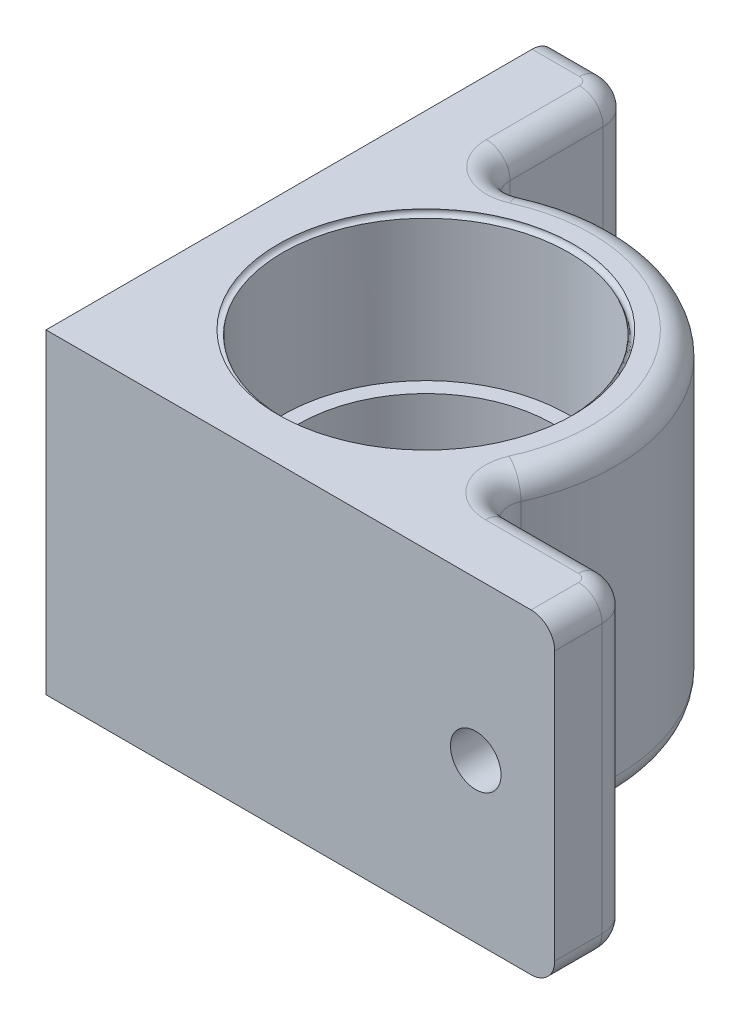
ISO-10303-21;
HEADER;
FILE_DESCRIPTION(('STEP AP214'),'2;1');
FILE_NAME('part.step','',(''),(''),'','','');
FILE_SCHEMA(('AUTOMOTIVE_DESIGN { 1 0 10303 214 1 1 1 1 }'));
ENDSEC;
DATA;
#1=APPLICATION_CONTEXT('core data for automotive mechanical design processes');
#2=APPLICATION_PROTOCOL_DEFINITION('international standard','automotive_design',2000,#1);
#3=PRODUCT_CONTEXT('',#1,'mechanical');
#4=PRODUCT('Part','Part','',(#3));
#5=PRODUCT_RELATED_PRODUCT_CATEGORY('part','',(#4));
#6=PRODUCT_DEFINITION_FORMATION('','',#4);
#7=PRODUCT_DEFINITION_CONTEXT('part definition',#1,'design');
#8=PRODUCT_DEFINITION('design','',#6,#7);
#9=PRODUCT_DEFINITION_SHAPE('','',#8);
#10=(LENGTH_UNIT() NAMED_UNIT(*) SI_UNIT(.MILLI.,.METRE.));
#11=(NAMED_UNIT(*) PLANE_ANGLE_UNIT() SI_UNIT($,.RADIAN.));
#12=(NAMED_UNIT(*) SI_UNIT($,.STERADIAN.) SOLID_ANGLE_UNIT());
#13=UNCERTAINTY_MEASURE_WITH_UNIT(LENGTH_MEASURE(1.E-05),#10,'distance_accuracy_value','');
#14=(GEOMETRIC_REPRESENTATION_CONTEXT(3) GLOBAL_UNCERTAINTY_ASSIGNED_CONTEXT((#13)) GLOBAL_UNIT_ASSIGNED_CONTEXT((#10,
#11,#12)) REPRESENTATION_CONTEXT('',''));
#15=CARTESIAN_POINT('',(0.,0.,0.));
#16=DIRECTION('',(0.,0.,1.));
#17=DIRECTION('',(1.,0.,0.));
#18=AXIS2_PLACEMENT_3D('',#15,#16,#17);
#19=CARTESIAN_POINT('',(60.9964175795956,-171.32327442611,171.000000000005));
#20=DIRECTION('',(0.,-1.,0.));
#21=DIRECTION('',(0.,0.,-1.));
#22=AXIS2_PLACEMENT_3D('',#19,#20,#21);
#23=CYLINDRICAL_SURFACE('',#22,8.05000000000001);
#24=CARTESIAN_POINT('',(60.9964175795957,-175.17327442611,171.000000000005));
#25=DIRECTION('',(0.,-1.,0.));
#26=DIRECTION('',(0.,0.,-1.));
#27=AXIS2_PLACEMENT_3D('',#24,#25,#26);
#28=CIRCLE('',#27,8.05000000000001);
#29=CARTESIAN_POINT('',(60.9964175795957,-175.17327442611,162.950000000005));
#30=VERTEX_POINT('',#29);
#31=EDGE_CURVE('E11',#30,#30,#28,.T.);
#32=ORIENTED_EDGE('',*,*,#31,.T.);
#33=EDGE_LOOP('',(#32));
#34=FACE_BOUND('',#33,.T.);
#35=CARTESIAN_POINT('',(60.9964175795956,-171.37327442611,171.000000000005));
#36=DIRECTION('',(0.,-1.,0.));
#37=DIRECTION('',(1.,0.,0.));
#38=AXIS2_PLACEMENT_3D('',#35,#36,#37);
#39=CIRCLE('',#38,8.05000000000001);
#40=CARTESIAN_POINT('',(69.0464175795956,-171.37327442611,171.000000000005));
#41=VERTEX_POINT('',#40);
#42=EDGE_CURVE('E228',#41,#41,#39,.T.);
#43=ORIENTED_EDGE('',*,*,#42,.F.);
#44=EDGE_LOOP('',(#43));
#45=FACE_BOUND('',#44,.T.);
#46=ADVANCED_FACE('F38',(#34,#45),#23,.F.);
#47=CARTESIAN_POINT('',(79.69443797963,-163.673274426109,173.540000042647));
#48=DIRECTION('',(0.,0.,-1.));
#49=DIRECTION('',(0.,-1.,0.));
#50=AXIS2_PLACEMENT_3D('',#47,#48,#49);
#51=CYLINDRICAL_SURFACE('',#50,1.5);
#52=DIRECTION('',(0.,0.,-1.));
#53=VECTOR('',#52,1.);
#54=CARTESIAN_POINT('',(81.19443797963,-163.673274426109,173.540000042647));
#55=LINE('',#54,#53);
#56=CARTESIAN_POINT('',(81.19443797963,-163.673274426109,183.040000042647));
#57=VERTEX_POINT('',#56);
#58=CARTESIAN_POINT('',(81.19443797963,-163.673274426109,180.040000042647));
#59=VERTEX_POINT('',#58);
#60=EDGE_CURVE('E57',#57,#59,#55,.T.);
#61=ORIENTED_EDGE('',*,*,#60,.T.);
#62=CARTESIAN_POINT('',(79.69443797963,-163.673274426109,180.040000042647));
#63=DIRECTION('',(0.,0.,1.));
#64=DIRECTION('',(1.,0.,0.));
#65=AXIS2_PLACEMENT_3D('',#62,#63,#64);
#66=CIRCLE('',#65,1.5);
#67=CARTESIAN_POINT('',(79.6944379796299,-162.173274426109,180.040000042647));
#68=VERTEX_POINT('',#67);
#69=EDGE_CURVE('E586',#59,#68,#66,.T.);
#70=ORIENTED_EDGE('',*,*,#69,.T.);
#71=DIRECTION('',(0.,0.,1.));
#72=VECTOR('',#71,1.);
#73=CARTESIAN_POINT('',(79.6944379796299,-162.173274426109,173.540000042647));
#74=LINE('',#73,#72);
#75=CARTESIAN_POINT('',(79.6944379796299,-162.173274426109,183.040000042647));
#76=VERTEX_POINT('',#75);
#77=EDGE_CURVE('E583',#68,#76,#74,.T.);
#78=ORIENTED_EDGE('',*,*,#77,.T.);
#79=CARTESIAN_POINT('',(79.69443797963,-163.673274426109,183.040000042647));
#80=DIRECTION('',(0.,0.,-1.));
#81=DIRECTION('',(0.,-1.,0.));
#82=AXIS2_PLACEMENT_3D('',#79,#80,#81);
#83=CIRCLE('',#82,1.5);
#84=EDGE_CURVE('E48',#76,#57,#83,.T.);
#85=ORIENTED_EDGE('',*,*,#84,.T.);
#86=EDGE_LOOP('',(#61,#70,#78,#85));
#87=FACE_BOUND('',#86,.T.);
#88=ADVANCED_FACE('F263',(#87),#51,.T.);
#89=CARTESIAN_POINT('',(79.19443797963,-163.673274426109,180.040000042647));
#90=DIRECTION('',(0.,-1.,0.));
#91=DIRECTION('',(0.,0.,-1.));
#92=AXIS2_PLACEMENT_3D('',#89,#90,#91);
#93=DEGENERATE_TOROIDAL_SURFACE('',#92,0.5,1.5,.T.);
#94=CARTESIAN_POINT('',(79.19443797963,-163.673274426109,179.540000042648));
#95=DIRECTION('',(1.,0.,0.));
#96=DIRECTION('',(0.,1.,0.));
#97=AXIS2_PLACEMENT_3D('',#94,#95,#96);
#98=CIRCLE('',#97,1.50000000000002);
#99=CARTESIAN_POINT('',(79.19443797963,-163.673274426109,178.040000042647));
#100=VERTEX_POINT('',#99);
#101=CARTESIAN_POINT('',(79.19443797963,-162.173274426109,179.540000042648));
#102=VERTEX_POINT('',#101);
#103=EDGE_CURVE('E580',#100,#102,#98,.T.);
#104=ORIENTED_EDGE('',*,*,#103,.T.);
#105=CARTESIAN_POINT('',(79.19443797963,-162.173274426109,180.040000042647));
#106=DIRECTION('',(0.,-1.,0.));
#107=DIRECTION('',(0.,0.,-1.));
#108=AXIS2_PLACEMENT_3D('',#105,#106,#107);
#109=CIRCLE('',#108,0.5);
#110=EDGE_CURVE('E577',#102,#68,#109,.T.);
#111=ORIENTED_EDGE('',*,*,#110,.T.);
#112=ORIENTED_EDGE('',*,*,#69,.F.);
#113=CARTESIAN_POINT('',(79.19443797963,-163.673274426109,180.040000042647));
#114=DIRECTION('',(0.,1.,0.));
#115=DIRECTION('',(1.,0.,0.));
#116=AXIS2_PLACEMENT_3D('',#113,#114,#115);
#117=CIRCLE('',#116,2.);
#118=EDGE_CURVE('E574',#59,#100,#117,.T.);
#119=ORIENTED_EDGE('',*,*,#118,.T.);
#120=EDGE_LOOP('',(#104,#111,#112,#119));
#121=FACE_BOUND('',#120,.T.);
#122=ADVANCED_FACE('F269',(#121),#93,.T.);
#123=CARTESIAN_POINT('',(66.9505892490733,-163.67327442611,179.540000042647));
#124=DIRECTION('',(-1.,0.,0.));
#125=DIRECTION('',(0.,1.,0.));
#126=AXIS2_PLACEMENT_3D('',#123,#124,#125);
#127=CYLINDRICAL_SURFACE('',#126,1.5);
#128=CARTESIAN_POINT('',(73.3073232947539,-163.673274426109,179.540000042647));
#129=DIRECTION('',(1.,0.,0.));
#130=DIRECTION('',(0.,1.,0.));
#131=AXIS2_PLACEMENT_3D('',#128,#129,#130);
#132=CIRCLE('',#131,1.49999999999999);
#133=CARTESIAN_POINT('',(73.3073232947539,-163.673274426109,178.040000042647));
#134=VERTEX_POINT('',#133);
#135=CARTESIAN_POINT('',(73.3073232947538,-162.173274426109,179.540000042647));
#136=VERTEX_POINT('',#135);
#137=EDGE_CURVE('E571',#134,#136,#132,.T.);
#138=ORIENTED_EDGE('',*,*,#137,.T.);
#139=DIRECTION('',(1.,0.,0.));
#140=VECTOR('',#139,1.);
#141=CARTESIAN_POINT('',(66.9505892490732,-162.17327442611,179.540000042647));
#142=LINE('',#141,#140);
#143=EDGE_CURVE('E568',#136,#102,#142,.T.);
#144=ORIENTED_EDGE('',*,*,#143,.T.);
#145=ORIENTED_EDGE('',*,*,#103,.F.);
#146=DIRECTION('',(-1.,0.,0.));
#147=VECTOR('',#146,1.);
#148=CARTESIAN_POINT('',(66.9505892490733,-163.67327442611,178.040000042647));
#149=LINE('',#148,#147);
#150=EDGE_CURVE('E565',#100,#134,#149,.T.);
#151=ORIENTED_EDGE('',*,*,#150,.T.);
#152=EDGE_LOOP('',(#138,#144,#145,#151));
#153=FACE_BOUND('',#152,.T.);
#154=ADVANCED_FACE('F274',(#153),#127,.T.);
#155=CARTESIAN_POINT('',(73.3073232947539,-163.673274426109,176.540000042648));
#156=DIRECTION('',(0.,1.,0.));
#157=DIRECTION('',(1.,0.,0.));
#158=AXIS2_PLACEMENT_3D('',#155,#156,#157);
#159=TOROIDAL_SURFACE('',#158,3.,1.5);
#160=CARTESIAN_POINT('',(70.5715664691631,-163.67327442611,175.30888892206));
#161=DIRECTION('',(-0.410370373529061,0.,0.911918941863595));
#162=DIRECTION('',(0.,1.,0.));
#163=AXIS2_PLACEMENT_3D('',#160,#161,#162);
#164=CIRCLE('',#163,1.49999999999997);
#165=CARTESIAN_POINT('',(71.9394448819585,-163.67327442611,175.924444482354));
#166=VERTEX_POINT('',#165);
#167=CARTESIAN_POINT('',(70.571566469163,-162.17327442611,175.30888892206));
#168=VERTEX_POINT('',#167);
#169=EDGE_CURVE('E562',#166,#168,#164,.T.);
#170=ORIENTED_EDGE('',*,*,#169,.T.);
#171=CARTESIAN_POINT('',(73.3073232947538,-162.173274426109,176.540000042648));
#172=DIRECTION('',(0.,1.,0.));
#173=DIRECTION('',(1.,0.,0.));
#174=AXIS2_PLACEMENT_3D('',#171,#172,#173);
#175=CIRCLE('',#174,3.);
#176=EDGE_CURVE('E559',#168,#136,#175,.T.);
#177=ORIENTED_EDGE('',*,*,#176,.T.);
#178=ORIENTED_EDGE('',*,*,#137,.F.);
#179=CARTESIAN_POINT('',(73.3073232947539,-163.673274426109,176.540000042648));
#180=DIRECTION('',(0.,-1.,0.));
#181=DIRECTION('',(0.,0.,-1.));
#182=AXIS2_PLACEMENT_3D('',#179,#180,#181);
#183=CIRCLE('',#182,1.5);
#184=EDGE_CURVE('E556',#134,#166,#183,.T.);
#185=ORIENTED_EDGE('',*,*,#184,.T.);
#186=EDGE_LOOP('',(#170,#177,#178,#185));
#187=FACE_BOUND('',#186,.T.);
#188=ADVANCED_FACE('F277',(#187),#159,.T.);
#189=CARTESIAN_POINT('',(60.9964175795953,-163.67327442611,171.000000000005));
#190=DIRECTION('',(0.,1.,0.));
#191=DIRECTION('',(1.,0.,0.));
#192=AXIS2_PLACEMENT_3D('',#189,#190,#191);
#193=TOROIDAL_SURFACE('',#192,10.5,1.5);
#194=CARTESIAN_POINT('',(56.7186556685112,-163.67327442611,161.410904472685));
#195=DIRECTION('',(0.91324719307814,0.,-0.407405896293732));
#196=DIRECTION('',(0.,-1.,0.));
#197=AXIS2_PLACEMENT_3D('',#194,#195,#196);
#198=CIRCLE('',#197,1.49999999999999);
#199=CARTESIAN_POINT('',(56.1075468240706,-163.67327442611,160.041033683067));
#200=VERTEX_POINT('',#199);
#201=CARTESIAN_POINT('',(56.7186556685111,-162.17327442611,161.410904472685));
#202=VERTEX_POINT('',#201);
#203=EDGE_CURVE('E553',#200,#202,#198,.T.);
#204=ORIENTED_EDGE('',*,*,#203,.T.);
#205=CARTESIAN_POINT('',(60.9964175795953,-162.17327442611,171.000000000005));
#206=DIRECTION('',(0.,-1.,0.));
#207=DIRECTION('',(0.,0.,-1.));
#208=AXIS2_PLACEMENT_3D('',#205,#206,#207);
#209=CIRCLE('',#208,10.5);
#210=EDGE_CURVE('E550',#202,#168,#209,.T.);
#211=ORIENTED_EDGE('',*,*,#210,.T.);
#212=ORIENTED_EDGE('',*,*,#169,.F.);
#213=CARTESIAN_POINT('',(60.9964175795953,-163.67327442611,171.000000000005));
#214=DIRECTION('',(0.,1.,0.));
#215=DIRECTION('',(1.,0.,0.));
#216=AXIS2_PLACEMENT_3D('',#213,#214,#215);
#217=CIRCLE('',#216,12.);
#218=EDGE_CURVE('E547',#166,#200,#217,.T.);
#219=ORIENTED_EDGE('',*,*,#218,.T.);
#220=EDGE_LOOP('',(#204,#211,#212,#219));
#221=FACE_BOUND('',#220,.T.);
#222=ADVANCED_FACE('F600',(#221),#193,.T.);
#223=CARTESIAN_POINT('',(55.49643797963,-163.67327442611,158.67116289345));
#224=DIRECTION('',(0.,1.,0.));
#225=DIRECTION('',(1.,0.,0.));
#226=AXIS2_PLACEMENT_3D('',#223,#224,#225);
#227=TOROIDAL_SURFACE('',#226,3.,1.5);
#228=CARTESIAN_POINT('',(52.49643797963,-163.67327442611,158.67116289345));
#229=DIRECTION('',(0.,0.,1.));
#230=DIRECTION('',(1.,0.,0.));
#231=AXIS2_PLACEMENT_3D('',#228,#229,#230);
#232=CIRCLE('',#231,1.49999999999999);
#233=CARTESIAN_POINT('',(53.99643797963,-163.67327442611,158.67116289345));
#234=VERTEX_POINT('',#233);
#235=CARTESIAN_POINT('',(52.4964379796299,-162.17327442611,158.67116289345));
#236=VERTEX_POINT('',#235);
#237=EDGE_CURVE('E544',#234,#236,#232,.T.);
#238=ORIENTED_EDGE('',*,*,#237,.T.);
#239=CARTESIAN_POINT('',(55.4964379796299,-162.17327442611,158.67116289345));
#240=DIRECTION('',(0.,1.,0.));
#241=DIRECTION('',(1.,0.,0.));
#242=AXIS2_PLACEMENT_3D('',#239,#240,#241);
#243=CIRCLE('',#242,3.);
#244=EDGE_CURVE('E541',#236,#202,#243,.T.);
#245=ORIENTED_EDGE('',*,*,#244,.T.);
#246=ORIENTED_EDGE('',*,*,#203,.F.);
#247=CARTESIAN_POINT('',(55.49643797963,-163.67327442611,158.67116289345));
#248=DIRECTION('',(0.,-1.,0.));
#249=DIRECTION('',(0.,0.,-1.));
#250=AXIS2_PLACEMENT_3D('',#247,#248,#249);
#251=CIRCLE('',#250,1.5);
#252=EDGE_CURVE('E538',#200,#234,#251,.T.);
#253=ORIENTED_EDGE('',*,*,#252,.T.);
#254=EDGE_LOOP('',(#238,#245,#246,#253));
#255=FACE_BOUND('',#254,.T.);
#256=ADVANCED_FACE('F283',(#255),#227,.T.);
#257=CARTESIAN_POINT('',(52.49643797963,-163.67327442611,161.697927492911));
#258=DIRECTION('',(0.,0.,-1.));
#259=DIRECTION('',(0.,-1.,0.));
#260=AXIS2_PLACEMENT_3D('',#257,#258,#259);
#261=CYLINDRICAL_SURFACE('',#260,1.5);
#262=CARTESIAN_POINT('',(52.49643797963,-163.67327442611,152.775000042647));
#263=DIRECTION('',(0.,0.,1.));
#264=DIRECTION('',(1.,0.,0.));
#265=AXIS2_PLACEMENT_3D('',#262,#263,#264);
#266=CIRCLE('',#265,1.5);
#267=CARTESIAN_POINT('',(53.99643797963,-163.67327442611,152.775000042647));
#268=VERTEX_POINT('',#267);
#269=CARTESIAN_POINT('',(52.4964379796299,-162.17327442611,152.775000042647));
#270=VERTEX_POINT('',#269);
#271=EDGE_CURVE('E529',#268,#270,#266,.T.);
#272=ORIENTED_EDGE('',*,*,#271,.T.);
#273=DIRECTION('',(0.,0.,1.));
#274=VECTOR('',#273,1.);
#275=CARTESIAN_POINT('',(52.4964379796299,-162.17327442611,161.697927492911));
#276=LINE('',#275,#274);
#277=EDGE_CURVE('E532',#270,#236,#276,.T.);
#278=ORIENTED_EDGE('',*,*,#277,.T.);
#279=ORIENTED_EDGE('',*,*,#237,.F.);
#280=DIRECTION('',(0.,0.,-1.));
#281=VECTOR('',#280,1.);
#282=CARTESIAN_POINT('',(53.99643797963,-163.67327442611,161.697927492911));
#283=LINE('',#282,#281);
#284=EDGE_CURVE('E530',#234,#268,#283,.T.);
#285=ORIENTED_EDGE('',*,*,#284,.T.);
#286=EDGE_LOOP('',(#272,#278,#279,#285));
#287=FACE_BOUND('',#286,.T.);
#288=ADVANCED_FACE('F279',(#287),#261,.T.);
#289=CARTESIAN_POINT('',(51.99643797963,-163.67327442611,152.775000042647));
#290=DIRECTION('',(0.,-1.,0.));
#291=DIRECTION('',(0.,0.,-1.));
#292=AXIS2_PLACEMENT_3D('',#289,#290,#291);
#293=DEGENERATE_TOROIDAL_SURFACE('',#292,0.5,1.5,.T.);
#294=CARTESIAN_POINT('',(51.99643797963,-163.67327442611,152.275000042647));
#295=DIRECTION('',(1.,0.,0.));
#296=DIRECTION('',(0.,1.,0.));
#297=AXIS2_PLACEMENT_3D('',#294,#295,#296);
#298=CIRCLE('',#297,1.49999999999999);
#299=CARTESIAN_POINT('',(51.99643797963,-163.67327442611,150.775000042647));
#300=VERTEX_POINT('',#299);
#301=CARTESIAN_POINT('',(51.9964379796299,-162.17327442611,152.275000042647));
#302=VERTEX_POINT('',#301);
#303=EDGE_CURVE('E527',#300,#302,#298,.T.);
#304=ORIENTED_EDGE('',*,*,#303,.T.);
#305=CARTESIAN_POINT('',(51.9964379796299,-162.17327442611,152.775000042647));
#306=DIRECTION('',(0.,-1.,0.));
#307=DIRECTION('',(0.,0.,-1.));
#308=AXIS2_PLACEMENT_3D('',#305,#306,#307);
#309=CIRCLE('',#308,0.5);
#310=EDGE_CURVE('E513',#302,#270,#309,.T.);
#311=ORIENTED_EDGE('',*,*,#310,.T.);
#312=ORIENTED_EDGE('',*,*,#271,.F.);
#313=CARTESIAN_POINT('',(51.99643797963,-163.67327442611,152.775000042647));
#314=DIRECTION('',(0.,1.,0.));
#315=DIRECTION('',(1.,0.,0.));
#316=AXIS2_PLACEMENT_3D('',#313,#314,#315);
#317=CIRCLE('',#316,2.);
#318=EDGE_CURVE('E480',#268,#300,#317,.T.);
#319=ORIENTED_EDGE('',*,*,#318,.T.);
#320=EDGE_LOOP('',(#304,#311,#312,#319));
#321=FACE_BOUND('',#320,.T.);
#322=ADVANCED_FACE('F282',(#321),#293,.T.);
#323=CARTESIAN_POINT('',(56.4964328796213,-163.67327442611,152.275000042647));
#324=DIRECTION('',(-1.,0.,0.));
#325=DIRECTION('',(0.,1.,0.));
#326=AXIS2_PLACEMENT_3D('',#323,#324,#325);
#327=CYLINDRICAL_SURFACE('',#326,1.5);
#328=CARTESIAN_POINT('',(48.99643797963,-163.67327442611,152.275000042647));
#329=DIRECTION('',(1.,0.,0.));
#330=DIRECTION('',(0.,1.,0.));
#331=AXIS2_PLACEMENT_3D('',#328,#329,#330);
#332=CIRCLE('',#331,1.5);
#333=CARTESIAN_POINT('',(48.99643797963,-163.67327442611,150.775000042647));
#334=VERTEX_POINT('',#333);
#335=CARTESIAN_POINT('',(48.9964379796299,-162.17327442611,152.275000042647));
#336=VERTEX_POINT('',#335);
#337=EDGE_CURVE('E509',#334,#336,#332,.T.);
#338=ORIENTED_EDGE('',*,*,#337,.T.);
#339=DIRECTION('',(1.,0.,0.));
#340=VECTOR('',#339,1.);
#341=CARTESIAN_POINT('',(56.4964328796213,-162.17327442611,152.275000042647));
#342=LINE('',#341,#340);
#343=EDGE_CURVE('E511',#336,#302,#342,.T.);
#344=ORIENTED_EDGE('',*,*,#343,.T.);
#345=ORIENTED_EDGE('',*,*,#303,.F.);
#346=DIRECTION('',(-1.,0.,0.));
#347=VECTOR('',#346,1.);
#348=CARTESIAN_POINT('',(56.4964328796213,-163.67327442611,150.775000042647));
#349=LINE('',#348,#347);
#350=EDGE_CURVE('E516',#300,#334,#349,.T.);
#351=ORIENTED_EDGE('',*,*,#350,.T.);
#352=EDGE_LOOP('',(#338,#344,#345,#351));
#353=FACE_BOUND('',#352,.T.);
#354=ADVANCED_FACE('F289',(#353),#327,.T.);
#355=CARTESIAN_POINT('',(48.9964379796303,-174.17327442611,150.775000042648));
#356=DIRECTION('',(0.,0.,-1.));
#357=DIRECTION('',(0.,1.,0.));
#358=AXIS2_PLACEMENT_3D('',#355,#356,#357);
#359=PLANE('',#358);
#360=ORIENTED_EDGE('',*,*,#350,.F.);
#361=DIRECTION('',(0.,1.,0.));
#362=VECTOR('',#361,1.);
#363=CARTESIAN_POINT('',(51.9964379796303,-173.17327442611,150.775000042648));
#364=LINE('',#363,#362);
#365=CARTESIAN_POINT('',(51.9964379796306,-180.67327442611,150.775000042648));
#366=VERTEX_POINT('',#365);
#367=EDGE_CURVE('E395',#366,#300,#364,.T.);
#368=ORIENTED_EDGE('',*,*,#367,.F.);
#369=DIRECTION('',(1.,0.,0.));
#370=VECTOR('',#369,1.);
#371=CARTESIAN_POINT('',(56.4964328796219,-180.67327442611,150.775000042648));
#372=LINE('',#371,#370);
#373=CARTESIAN_POINT('',(48.9964379796306,-180.67327442611,150.775000042648));
#374=VERTEX_POINT('',#373);
#375=EDGE_CURVE('E192',#374,#366,#372,.T.);
#376=ORIENTED_EDGE('',*,*,#375,.F.);
#377=DIRECTION('',(0.,1.,0.));
#378=VECTOR('',#377,1.);
#379=CARTESIAN_POINT('',(48.9964379796303,-174.17327442611,150.775000042647));
#380=LINE('',#379,#378);
#381=EDGE_CURVE('E203',#374,#334,#380,.T.);
#382=ORIENTED_EDGE('',*,*,#381,.T.);
#383=EDGE_LOOP('',(#360,#368,#376,#382));
#384=FACE_BOUND('',#383,.T.);
#385=ADVANCED_FACE('F285',(#384),#359,.T.);
#386=CARTESIAN_POINT('',(51.9964379796303,-173.17327442611,152.775000042648));
#387=DIRECTION('',(0.,1.,0.));
#388=DIRECTION('',(1.,0.,0.));
#389=AXIS2_PLACEMENT_3D('',#386,#387,#388);
#390=CYLINDRICAL_SURFACE('',#389,2.);
#391=ORIENTED_EDGE('',*,*,#318,.F.);
#392=DIRECTION('',(0.,-1.,0.));
#393=VECTOR('',#392,1.);
#394=CARTESIAN_POINT('',(53.9964379796303,-173.17327442611,152.775000042648));
#395=LINE('',#394,#393);
#396=CARTESIAN_POINT('',(53.9964379796306,-180.67327442611,152.775000042648));
#397=VERTEX_POINT('',#396);
#398=EDGE_CURVE('E476',#268,#397,#395,.T.);
#399=ORIENTED_EDGE('',*,*,#398,.T.);
#400=CARTESIAN_POINT('',(51.9964379796306,-180.67327442611,152.775000042648));
#401=DIRECTION('',(0.,-1.,0.));
#402=DIRECTION('',(0.,0.,-1.));
#403=AXIS2_PLACEMENT_3D('',#400,#401,#402);
#404=CIRCLE('',#403,2.);
#405=EDGE_CURVE('E382',#366,#397,#404,.T.);
#406=ORIENTED_EDGE('',*,*,#405,.F.);
#407=ORIENTED_EDGE('',*,*,#367,.T.);
#408=EDGE_LOOP('',(#391,#399,#406,#407));
#409=FACE_BOUND('',#408,.T.);
#410=ADVANCED_FACE('F288',(#409),#390,.T.);
#411=CARTESIAN_POINT('',(53.9964379796303,-172.17327442611,155.355854943175));
#412=DIRECTION('',(1.,0.,0.));
#413=DIRECTION('',(0.,1.,0.));
#414=AXIS2_PLACEMENT_3D('',#411,#412,#413);
#415=PLANE('',#414);
#416=CARTESIAN_POINT('',(53.9964379796303,-172.17327442611,155.775014209364));
#417=DIRECTION('',(1.,0.,0.));
#418=DIRECTION('',(0.,1.,0.));
#419=AXIS2_PLACEMENT_3D('',#416,#417,#418);
#420=CIRCLE('',#419,1.6);
#421=CARTESIAN_POINT('',(53.9964379796302,-170.57327442611,155.775014209364));
#422=VERTEX_POINT('',#421);
#423=EDGE_CURVE('E225',#422,#422,#420,.T.);
#424=ORIENTED_EDGE('',*,*,#423,.F.);
#425=EDGE_LOOP('',(#424));
#426=FACE_BOUND('',#425,.T.);
#427=ORIENTED_EDGE('',*,*,#284,.F.);
#428=DIRECTION('',(0.,1.,0.));
#429=VECTOR('',#428,1.);
#430=CARTESIAN_POINT('',(53.9964379796303,-174.17327442611,158.67116289345));
#431=LINE('',#430,#429);
#432=CARTESIAN_POINT('',(53.9964379796306,-180.67327442611,158.67116289345));
#433=VERTEX_POINT('',#432);
#434=EDGE_CURVE('E384',#433,#234,#431,.T.);
#435=ORIENTED_EDGE('',*,*,#434,.F.);
#436=DIRECTION('',(0.,0.,1.));
#437=VECTOR('',#436,1.);
#438=CARTESIAN_POINT('',(53.9964379796306,-180.67327442611,161.697927492911));
#439=LINE('',#438,#437);
#440=EDGE_CURVE('E389',#397,#433,#439,.T.);
#441=ORIENTED_EDGE('',*,*,#440,.F.);
#442=ORIENTED_EDGE('',*,*,#398,.F.);
#443=EDGE_LOOP('',(#427,#435,#441,#442));
#444=FACE_BOUND('',#443,.T.);
#445=ADVANCED_FACE('F296',(#426,#444),#415,.T.);
#446=CARTESIAN_POINT('',(55.4964379796304,-174.17327442611,158.67116289345));
#447=DIRECTION('',(0.,1.,0.));
#448=DIRECTION('',(1.,0.,0.));
#449=AXIS2_PLACEMENT_3D('',#446,#447,#448);
#450=CYLINDRICAL_SURFACE('',#449,1.5);
#451=ORIENTED_EDGE('',*,*,#252,.F.);
#452=DIRECTION('',(0.,-1.,0.));
#453=VECTOR('',#452,1.);
#454=CARTESIAN_POINT('',(56.1075468240709,-174.17327442611,160.041033683067));
#455=LINE('',#454,#453);
#456=CARTESIAN_POINT('',(56.1075468240712,-180.67327442611,160.041033683068));
#457=VERTEX_POINT('',#456);
#458=EDGE_CURVE('E387',#200,#457,#455,.T.);
#459=ORIENTED_EDGE('',*,*,#458,.T.);
#460=CARTESIAN_POINT('',(55.4964379796306,-180.67327442611,158.67116289345));
#461=DIRECTION('',(0.,1.,0.));
#462=DIRECTION('',(1.,0.,0.));
#463=AXIS2_PLACEMENT_3D('',#460,#461,#462);
#464=CIRCLE('',#463,1.5);
#465=EDGE_CURVE('E396',#433,#457,#464,.T.);
#466=ORIENTED_EDGE('',*,*,#465,.F.);
#467=ORIENTED_EDGE('',*,*,#434,.T.);
#468=EDGE_LOOP('',(#451,#459,#466,#467));
#469=FACE_BOUND('',#468,.T.);
#470=ADVANCED_FACE('F298',(#469),#450,.F.);
#471=CARTESIAN_POINT('',(60.9964175795957,-174.17327442611,171.000000000005));
#472=DIRECTION('',(0.,-1.,0.));
#473=DIRECTION('',(0.,0.,-1.));
#474=AXIS2_PLACEMENT_3D('',#471,#472,#473);
#475=CYLINDRICAL_SURFACE('',#474,12.);
#476=ORIENTED_EDGE('',*,*,#218,.F.);
#477=DIRECTION('',(0.,1.,0.));
#478=VECTOR('',#477,1.);
#479=CARTESIAN_POINT('',(71.9394448819588,-174.173274426109,175.924444482354));
#480=LINE('',#479,#478);
#481=CARTESIAN_POINT('',(71.939444881959,-180.67327442611,175.924444482354));
#482=VERTEX_POINT('',#481);
#483=EDGE_CURVE('E400',#482,#166,#480,.T.);
#484=ORIENTED_EDGE('',*,*,#483,.F.);
#485=CARTESIAN_POINT('',(60.9964175795959,-180.67327442611,171.000000000005));
#486=DIRECTION('',(0.,-1.,0.));
#487=DIRECTION('',(0.,0.,-1.));
#488=AXIS2_PLACEMENT_3D('',#485,#486,#487);
#489=CIRCLE('',#488,12.);
#490=EDGE_CURVE('E404',#457,#482,#489,.T.);
#491=ORIENTED_EDGE('',*,*,#490,.F.);
#492=ORIENTED_EDGE('',*,*,#458,.F.);
#493=EDGE_LOOP('',(#476,#484,#491,#492));
#494=FACE_BOUND('',#493,.T.);
#495=ADVANCED_FACE('F301',(#494),#475,.T.);
#496=CARTESIAN_POINT('',(73.3073232947542,-174.173274426109,176.540000042648));
#497=DIRECTION('',(0.,1.,0.));
#498=DIRECTION('',(1.,0.,0.));
#499=AXIS2_PLACEMENT_3D('',#496,#497,#498);
#500=CYLINDRICAL_SURFACE('',#499,1.5);
#501=ORIENTED_EDGE('',*,*,#184,.F.);
#502=DIRECTION('',(0.,-1.,0.));
#503=VECTOR('',#502,1.);
#504=CARTESIAN_POINT('',(73.3073232947542,-174.173274426109,178.040000042648));
#505=LINE('',#504,#503);
#506=CARTESIAN_POINT('',(73.3073232947544,-180.673274426109,178.040000042648));
#507=VERTEX_POINT('',#506);
#508=EDGE_CURVE('E388',#134,#507,#505,.T.);
#509=ORIENTED_EDGE('',*,*,#508,.T.);
#510=CARTESIAN_POINT('',(73.3073232947544,-180.673274426109,176.540000042648));
#511=DIRECTION('',(0.,1.,0.));
#512=DIRECTION('',(1.,0.,0.));
#513=AXIS2_PLACEMENT_3D('',#510,#511,#512);
#514=CIRCLE('',#513,1.5);
#515=EDGE_CURVE('E410',#482,#507,#514,.T.);
#516=ORIENTED_EDGE('',*,*,#515,.F.);
#517=ORIENTED_EDGE('',*,*,#483,.T.);
#518=EDGE_LOOP('',(#501,#509,#516,#517));
#519=FACE_BOUND('',#518,.T.);
#520=ADVANCED_FACE('F307',(#519),#500,.F.);
#521=CARTESIAN_POINT('',(69.9047507185343,-174.17327442611,178.040000042648));
#522=DIRECTION('',(0.,0.,-1.));
#523=DIRECTION('',(0.,1.,0.));
#524=AXIS2_PLACEMENT_3D('',#521,#522,#523);
#525=PLANE('',#524);
#526=CARTESIAN_POINT('',(76.1945602540284,-172.173274426109,178.040000042648));
#527=DIRECTION('',(0.,0.,1.));
#528=DIRECTION('',(0.,-1.,0.));
#529=AXIS2_PLACEMENT_3D('',#526,#527,#528);
#530=CIRCLE('',#529,1.6);
#531=CARTESIAN_POINT('',(76.1945602540284,-173.773274426109,178.040000042648));
#532=VERTEX_POINT('',#531);
#533=EDGE_CURVE('E403',#532,#532,#530,.T.);
#534=ORIENTED_EDGE('',*,*,#533,.T.);
#535=EDGE_LOOP('',(#534));
#536=FACE_BOUND('',#535,.T.);
#537=ORIENTED_EDGE('',*,*,#150,.F.);
#538=DIRECTION('',(0.,1.,0.));
#539=VECTOR('',#538,1.);
#540=CARTESIAN_POINT('',(79.1944379796304,-174.173274426109,178.040000042648));
#541=LINE('',#540,#539);
#542=CARTESIAN_POINT('',(79.1944379796306,-180.673274426109,178.040000042648));
#543=VERTEX_POINT('',#542);
#544=EDGE_CURVE('E417',#543,#100,#541,.T.);
#545=ORIENTED_EDGE('',*,*,#544,.F.);
#546=DIRECTION('',(1.,0.,0.));
#547=VECTOR('',#546,1.);
#548=CARTESIAN_POINT('',(66.9505892490739,-180.67327442611,178.040000042648));
#549=LINE('',#548,#547);
#550=EDGE_CURVE('E421',#507,#543,#549,.T.);
#551=ORIENTED_EDGE('',*,*,#550,.F.);
#552=ORIENTED_EDGE('',*,*,#508,.F.);
#553=EDGE_LOOP('',(#537,#545,#551,#552));
#554=FACE_BOUND('',#553,.T.);
#555=ADVANCED_FACE('F303',(#536,#554),#525,.T.);
#556=CARTESIAN_POINT('',(79.1944379796304,-174.173274426109,180.040000042648));
#557=DIRECTION('',(0.,-1.,0.));
#558=DIRECTION('',(0.,0.,-1.));
#559=AXIS2_PLACEMENT_3D('',#556,#557,#558);
#560=CYLINDRICAL_SURFACE('',#559,2.);
#561=ORIENTED_EDGE('',*,*,#118,.F.);
#562=DIRECTION('',(0.,-1.,0.));
#563=VECTOR('',#562,1.);
#564=CARTESIAN_POINT('',(81.1944379796303,-174.173274426109,180.040000042648));
#565=LINE('',#564,#563);
#566=CARTESIAN_POINT('',(81.1944379796306,-180.673274426109,180.040000042648));
#567=VERTEX_POINT('',#566);
#568=EDGE_CURVE('E416',#59,#567,#565,.T.);
#569=ORIENTED_EDGE('',*,*,#568,.T.);
#570=CARTESIAN_POINT('',(79.1944379796306,-180.673274426109,180.040000042648));
#571=DIRECTION('',(0.,-1.,0.));
#572=DIRECTION('',(0.,0.,-1.));
#573=AXIS2_PLACEMENT_3D('',#570,#571,#572);
#574=CIRCLE('',#573,2.);
#575=EDGE_CURVE('E427',#543,#567,#574,.T.);
#576=ORIENTED_EDGE('',*,*,#575,.F.);
#577=ORIENTED_EDGE('',*,*,#544,.T.);
#578=EDGE_LOOP('',(#561,#569,#576,#577));
#579=FACE_BOUND('',#578,.T.);
#580=ADVANCED_FACE('F306',(#579),#560,.T.);
#581=CARTESIAN_POINT('',(81.1944379796303,-174.173274426109,179.040000042648));
#582=DIRECTION('',(1.,0.,0.));
#583=DIRECTION('',(0.,1.,0.));
#584=AXIS2_PLACEMENT_3D('',#581,#582,#583);
#585=PLANE('',#584);
#586=DIRECTION('',(0.,1.,0.));
#587=VECTOR('',#586,1.);
#588=CARTESIAN_POINT('',(81.1944379796303,-174.173274426109,183.040000042648));
#589=LINE('',#588,#587);
#590=CARTESIAN_POINT('',(81.1944379796306,-180.673274426109,183.040000042648));
#591=VERTEX_POINT('',#590);
#592=EDGE_CURVE('E431',#591,#57,#589,.T.);
#593=ORIENTED_EDGE('',*,*,#592,.F.);
#594=DIRECTION('',(0.,0.,1.));
#595=VECTOR('',#594,1.);
#596=CARTESIAN_POINT('',(81.1944379796306,-180.673274426109,173.540000042648));
#597=LINE('',#596,#595);
#598=EDGE_CURVE('E435',#567,#591,#597,.T.);
#599=ORIENTED_EDGE('',*,*,#598,.F.);
#600=ORIENTED_EDGE('',*,*,#568,.F.);
#601=ORIENTED_EDGE('',*,*,#60,.F.);
#602=EDGE_LOOP('',(#593,#599,#600,#601));
#603=FACE_BOUND('',#602,.T.);
#604=ADVANCED_FACE('F312',(#603),#585,.T.);
#605=CARTESIAN_POINT('',(78.9964379796303,-174.173274426109,183.040000042648));
#606=DIRECTION('',(0.,0.,1.));
#607=DIRECTION('',(0.,-1.,0.));
#608=AXIS2_PLACEMENT_3D('',#605,#606,#607);
#609=PLANE('',#608);
#610=ORIENTED_EDGE('',*,*,#84,.F.);
#611=DIRECTION('',(-1.,0.,0.));
#612=VECTOR('',#611,1.);
#613=CARTESIAN_POINT('',(71.4964328796213,-162.173274426109,183.040000042647));
#614=LINE('',#613,#612);
#615=CARTESIAN_POINT('',(48.9964379796299,-162.17327442611,183.040000042647));
#616=VERTEX_POINT('',#615);
#617=EDGE_CURVE('E420',#76,#616,#614,.T.);
#618=ORIENTED_EDGE('',*,*,#617,.T.);
#619=DIRECTION('',(0.,1.,0.));
#620=VECTOR('',#619,1.);
#621=CARTESIAN_POINT('',(48.9964379796303,-174.17327442611,183.040000042648));
#622=LINE('',#621,#620);
#623=CARTESIAN_POINT('',(48.9964379796306,-182.17327442611,183.040000042648));
#624=VERTEX_POINT('',#623);
#625=EDGE_CURVE('E212',#624,#616,#622,.T.);
#626=ORIENTED_EDGE('',*,*,#625,.F.);
#627=DIRECTION('',(1.,0.,0.));
#628=VECTOR('',#627,1.);
#629=CARTESIAN_POINT('',(71.496432879622,-182.173274426109,183.040000042648));
#630=LINE('',#629,#628);
#631=CARTESIAN_POINT('',(79.6944379796306,-182.173274426109,183.040000042648));
#632=VERTEX_POINT('',#631);
#633=EDGE_CURVE('E210',#624,#632,#630,.T.);
#634=ORIENTED_EDGE('',*,*,#633,.T.);
#635=CARTESIAN_POINT('',(79.6944379796306,-180.673274426109,183.040000042648));
#636=DIRECTION('',(0.,0.,-1.));
#637=DIRECTION('',(0.,-1.,0.));
#638=AXIS2_PLACEMENT_3D('',#635,#636,#637);
#639=CIRCLE('',#638,1.5);
#640=EDGE_CURVE('E441',#591,#632,#639,.T.);
#641=ORIENTED_EDGE('',*,*,#640,.F.);
#642=ORIENTED_EDGE('',*,*,#592,.T.);
#643=EDGE_LOOP('',(#610,#618,#626,#634,#641,#642));
#644=FACE_BOUND('',#643,.T.);
#645=CARTESIAN_POINT('',(76.1945602540284,-172.173274426109,183.040000042648));
#646=DIRECTION('',(0.,0.,-1.));
#647=DIRECTION('',(0.,-1.,0.));
#648=AXIS2_PLACEMENT_3D('',#645,#646,#647);
#649=CIRCLE('',#648,1.6);
#650=CARTESIAN_POINT('',(76.1945602540284,-173.773274426109,183.040000042648));
#651=VERTEX_POINT('',#650);
#652=EDGE_CURVE('E434',#651,#651,#649,.T.);
#653=ORIENTED_EDGE('',*,*,#652,.T.);
#654=EDGE_LOOP('',(#653));
#655=FACE_BOUND('',#654,.T.);
#656=ADVANCED_FACE('F315',(#644,#655),#609,.T.);
#657=CARTESIAN_POINT('',(79.6944379796306,-180.673274426109,173.540000042648));
#658=DIRECTION('',(0.,0.,-1.));
#659=DIRECTION('',(0.,-1.,0.));
#660=AXIS2_PLACEMENT_3D('',#657,#658,#659);
#661=CYLINDRICAL_SURFACE('',#660,1.5);
#662=DIRECTION('',(0.,0.,-1.));
#663=VECTOR('',#662,1.);
#664=CARTESIAN_POINT('',(79.6944379796306,-182.173274426109,173.540000042648));
#665=LINE('',#664,#663);
#666=CARTESIAN_POINT('',(79.6944379796306,-182.173274426109,180.040000042648));
#667=VERTEX_POINT('',#666);
#668=EDGE_CURVE('E443',#632,#667,#665,.T.);
#669=ORIENTED_EDGE('',*,*,#668,.T.);
#670=CARTESIAN_POINT('',(79.6944379796306,-180.673274426109,180.040000042648));
#671=DIRECTION('',(0.,0.,1.));
#672=DIRECTION('',(1.,0.,0.));
#673=AXIS2_PLACEMENT_3D('',#670,#671,#672);
#674=CIRCLE('',#673,1.49999999999999);
#675=EDGE_CURVE('E437',#667,#567,#674,.T.);
#676=ORIENTED_EDGE('',*,*,#675,.T.);
#677=ORIENTED_EDGE('',*,*,#598,.T.);
#678=ORIENTED_EDGE('',*,*,#640,.T.);
#679=EDGE_LOOP('',(#669,#676,#677,#678));
#680=FACE_BOUND('',#679,.T.);
#681=ADVANCED_FACE('F318',(#680),#661,.T.);
#682=CARTESIAN_POINT('',(79.1944379796306,-180.673274426109,180.040000042648));
#683=DIRECTION('',(0.,1.,0.));
#684=DIRECTION('',(1.,0.,0.));
#685=AXIS2_PLACEMENT_3D('',#682,#683,#684);
#686=DEGENERATE_TOROIDAL_SURFACE('',#685,0.5,1.5,.T.);
#687=CARTESIAN_POINT('',(79.1944379796306,-180.673274426109,179.540000042648));
#688=DIRECTION('',(1.,0.,0.));
#689=DIRECTION('',(0.,1.,0.));
#690=AXIS2_PLACEMENT_3D('',#687,#688,#689);
#691=CIRCLE('',#690,1.49999999999995);
#692=CARTESIAN_POINT('',(79.1944379796306,-182.173274426109,179.540000042648));
#693=VERTEX_POINT('',#692);
#694=EDGE_CURVE('E429',#693,#543,#691,.T.);
#695=ORIENTED_EDGE('',*,*,#694,.T.);
#696=ORIENTED_EDGE('',*,*,#575,.T.);
#697=ORIENTED_EDGE('',*,*,#675,.F.);
#698=CARTESIAN_POINT('',(79.1944379796306,-182.173274426109,180.040000042648));
#699=DIRECTION('',(0.,1.,0.));
#700=DIRECTION('',(1.,0.,0.));
#701=AXIS2_PLACEMENT_3D('',#698,#699,#700);
#702=CIRCLE('',#701,0.5);
#703=EDGE_CURVE('E430',#667,#693,#702,.T.);
#704=ORIENTED_EDGE('',*,*,#703,.T.);
#705=EDGE_LOOP('',(#695,#696,#697,#704));
#706=FACE_BOUND('',#705,.T.);
#707=ADVANCED_FACE('F325',(#706),#686,.T.);
#708=CARTESIAN_POINT('',(66.9505892490739,-180.67327442611,179.540000042648));
#709=DIRECTION('',(-1.,0.,0.));
#710=DIRECTION('',(0.,1.,0.));
#711=AXIS2_PLACEMENT_3D('',#708,#709,#710);
#712=CYLINDRICAL_SURFACE('',#711,1.5);
#713=CARTESIAN_POINT('',(73.3073232947544,-180.673274426109,179.540000042648));
#714=DIRECTION('',(1.,0.,0.));
#715=DIRECTION('',(0.,1.,0.));
#716=AXIS2_PLACEMENT_3D('',#713,#714,#715);
#717=CIRCLE('',#716,1.49999999999999);
#718=CARTESIAN_POINT('',(73.3073232947545,-182.173274426109,179.540000042648));
#719=VERTEX_POINT('',#718);
#720=EDGE_CURVE('E423',#719,#507,#717,.T.);
#721=ORIENTED_EDGE('',*,*,#720,.T.);
#722=ORIENTED_EDGE('',*,*,#550,.T.);
#723=ORIENTED_EDGE('',*,*,#694,.F.);
#724=DIRECTION('',(-1.,0.,0.));
#725=VECTOR('',#724,1.);
#726=CARTESIAN_POINT('',(66.9505892490739,-182.17327442611,179.540000042648));
#727=LINE('',#726,#725);
#728=EDGE_CURVE('E424',#693,#719,#727,.T.);
#729=ORIENTED_EDGE('',*,*,#728,.T.);
#730=EDGE_LOOP('',(#721,#722,#723,#729));
#731=FACE_BOUND('',#730,.T.);
#732=ADVANCED_FACE('F327',(#731),#712,.T.);
#733=CARTESIAN_POINT('',(73.3073232947544,-180.673274426109,176.540000042648));
#734=DIRECTION('',(0.,-1.,0.));
#735=DIRECTION('',(0.,0.,-1.));
#736=AXIS2_PLACEMENT_3D('',#733,#734,#735);
#737=TOROIDAL_SURFACE('',#736,3.,1.5);
#738=CARTESIAN_POINT('',(70.5715664691637,-180.67327442611,175.30888892206));
#739=DIRECTION('',(-0.410370373529061,0.,0.911918941863595));
#740=DIRECTION('',(0.,1.,0.));
#741=AXIS2_PLACEMENT_3D('',#738,#739,#740);
#742=CIRCLE('',#741,1.49999999999999);
#743=CARTESIAN_POINT('',(70.5715664691637,-182.17327442611,175.30888892206));
#744=VERTEX_POINT('',#743);
#745=EDGE_CURVE('E412',#744,#482,#742,.T.);
#746=ORIENTED_EDGE('',*,*,#745,.T.);
#747=ORIENTED_EDGE('',*,*,#515,.T.);
#748=ORIENTED_EDGE('',*,*,#720,.F.);
#749=CARTESIAN_POINT('',(73.3073232947545,-182.173274426109,176.540000042648));
#750=DIRECTION('',(0.,-1.,0.));
#751=DIRECTION('',(0.,0.,-1.));
#752=AXIS2_PLACEMENT_3D('',#749,#750,#751);
#753=CIRCLE('',#752,3.);
#754=EDGE_CURVE('E413',#719,#744,#753,.T.);
#755=ORIENTED_EDGE('',*,*,#754,.T.);
#756=EDGE_LOOP('',(#746,#747,#748,#755));
#757=FACE_BOUND('',#756,.T.);
#758=ADVANCED_FACE('F330',(#757),#737,.T.);
#759=CARTESIAN_POINT('',(60.9964175795959,-180.67327442611,171.000000000005));
#760=DIRECTION('',(0.,1.,0.));
#761=DIRECTION('',(1.,0.,0.));
#762=AXIS2_PLACEMENT_3D('',#759,#760,#761);
#763=TOROIDAL_SURFACE('',#762,10.5,1.5);
#764=CARTESIAN_POINT('',(56.7186556685118,-180.67327442611,161.410904472685));
#765=DIRECTION('',(0.91324719307814,0.,-0.407405896293732));
#766=DIRECTION('',(0.,-1.,0.));
#767=AXIS2_PLACEMENT_3D('',#764,#765,#766);
#768=CIRCLE('',#767,1.49999999999999);
#769=CARTESIAN_POINT('',(56.7186556685118,-182.17327442611,161.410904472685));
#770=VERTEX_POINT('',#769);
#771=EDGE_CURVE('E406',#770,#457,#768,.T.);
#772=ORIENTED_EDGE('',*,*,#771,.T.);
#773=ORIENTED_EDGE('',*,*,#490,.T.);
#774=ORIENTED_EDGE('',*,*,#745,.F.);
#775=CARTESIAN_POINT('',(60.9964175795959,-182.17327442611,171.000000000005));
#776=DIRECTION('',(0.,1.,0.));
#777=DIRECTION('',(1.,0.,0.));
#778=AXIS2_PLACEMENT_3D('',#775,#776,#777);
#779=CIRCLE('',#778,10.5);
#780=EDGE_CURVE('E407',#744,#770,#779,.T.);
#781=ORIENTED_EDGE('',*,*,#780,.T.);
#782=EDGE_LOOP('',(#772,#773,#774,#781));
#783=FACE_BOUND('',#782,.T.);
#784=ADVANCED_FACE('F490',(#783),#763,.T.);
#785=CARTESIAN_POINT('',(55.4964379796306,-180.67327442611,158.67116289345));
#786=DIRECTION('',(0.,-1.,0.));
#787=DIRECTION('',(0.,0.,-1.));
#788=AXIS2_PLACEMENT_3D('',#785,#786,#787);
#789=TOROIDAL_SURFACE('',#788,3.,1.5);
#790=CARTESIAN_POINT('',(52.4964379796306,-180.67327442611,158.67116289345));
#791=DIRECTION('',(0.,0.,1.));
#792=DIRECTION('',(1.,0.,0.));
#793=AXIS2_PLACEMENT_3D('',#790,#791,#792);
#794=CIRCLE('',#793,1.49999999999999);
#795=CARTESIAN_POINT('',(52.4964379796306,-182.17327442611,158.67116289345));
#796=VERTEX_POINT('',#795);
#797=EDGE_CURVE('E398',#796,#433,#794,.T.);
#798=ORIENTED_EDGE('',*,*,#797,.T.);
#799=ORIENTED_EDGE('',*,*,#465,.T.);
#800=ORIENTED_EDGE('',*,*,#771,.F.);
#801=CARTESIAN_POINT('',(55.4964379796306,-182.17327442611,158.67116289345));
#802=DIRECTION('',(0.,-1.,0.));
#803=DIRECTION('',(0.,0.,-1.));
#804=AXIS2_PLACEMENT_3D('',#801,#802,#803);
#805=CIRCLE('',#804,3.);
#806=EDGE_CURVE('E399',#770,#796,#805,.T.);
#807=ORIENTED_EDGE('',*,*,#806,.T.);
#808=EDGE_LOOP('',(#798,#799,#800,#807));
#809=FACE_BOUND('',#808,.T.);
#810=ADVANCED_FACE('F336',(#809),#789,.T.);
#811=CARTESIAN_POINT('',(52.4964379796306,-180.67327442611,161.697927492911));
#812=DIRECTION('',(0.,0.,-1.));
#813=DIRECTION('',(0.,-1.,0.));
#814=AXIS2_PLACEMENT_3D('',#811,#812,#813);
#815=CYLINDRICAL_SURFACE('',#814,1.5);
#816=CARTESIAN_POINT('',(52.4964379796306,-180.67327442611,152.775000042648));
#817=DIRECTION('',(0.,0.,1.));
#818=DIRECTION('',(1.,0.,0.));
#819=AXIS2_PLACEMENT_3D('',#816,#817,#818);
#820=CIRCLE('',#819,1.49999999999999);
#821=CARTESIAN_POINT('',(52.4964379796306,-182.17327442611,152.775000042648));
#822=VERTEX_POINT('',#821);
#823=EDGE_CURVE('E391',#822,#397,#820,.T.);
#824=ORIENTED_EDGE('',*,*,#823,.T.);
#825=ORIENTED_EDGE('',*,*,#440,.T.);
#826=ORIENTED_EDGE('',*,*,#797,.F.);
#827=DIRECTION('',(0.,0.,-1.));
#828=VECTOR('',#827,1.);
#829=CARTESIAN_POINT('',(52.4964379796306,-182.17327442611,161.697927492911));
#830=LINE('',#829,#828);
#831=EDGE_CURVE('E392',#796,#822,#830,.T.);
#832=ORIENTED_EDGE('',*,*,#831,.T.);
#833=EDGE_LOOP('',(#824,#825,#826,#832));
#834=FACE_BOUND('',#833,.T.);
#835=ADVANCED_FACE('F332',(#834),#815,.T.);
#836=CARTESIAN_POINT('',(51.9964379796306,-180.67327442611,152.775000042648));
#837=DIRECTION('',(0.,1.,0.));
#838=DIRECTION('',(1.,0.,0.));
#839=AXIS2_PLACEMENT_3D('',#836,#837,#838);
#840=DEGENERATE_TOROIDAL_SURFACE('',#839,0.5,1.5,.T.);
#841=CARTESIAN_POINT('',(51.9964379796306,-180.67327442611,152.275000042648));
#842=DIRECTION('',(1.,0.,0.));
#843=DIRECTION('',(0.,1.,0.));
#844=AXIS2_PLACEMENT_3D('',#841,#842,#843);
#845=CIRCLE('',#844,1.49999999999999);
#846=CARTESIAN_POINT('',(51.9964379796306,-182.17327442611,152.275000042648));
#847=VERTEX_POINT('',#846);
#848=EDGE_CURVE('E189',#847,#366,#845,.T.);
#849=ORIENTED_EDGE('',*,*,#848,.T.);
#850=ORIENTED_EDGE('',*,*,#405,.T.);
#851=ORIENTED_EDGE('',*,*,#823,.F.);
#852=CARTESIAN_POINT('',(51.9964379796306,-182.17327442611,152.775000042648));
#853=DIRECTION('',(0.,1.,0.));
#854=DIRECTION('',(1.,0.,0.));
#855=AXIS2_PLACEMENT_3D('',#852,#853,#854);
#856=CIRCLE('',#855,0.5);
#857=EDGE_CURVE('E179',#822,#847,#856,.T.);
#858=ORIENTED_EDGE('',*,*,#857,.T.);
#859=EDGE_LOOP('',(#849,#850,#851,#858));
#860=FACE_BOUND('',#859,.T.);
#861=ADVANCED_FACE('F335',(#860),#840,.T.);
#862=CARTESIAN_POINT('',(56.4964328796219,-180.67327442611,152.275000042648));
#863=DIRECTION('',(-1.,0.,0.));
#864=DIRECTION('',(0.,1.,0.));
#865=AXIS2_PLACEMENT_3D('',#862,#863,#864);
#866=CYLINDRICAL_SURFACE('',#865,1.5);
#867=CARTESIAN_POINT('',(48.9964379796306,-180.67327442611,152.275000042648));
#868=DIRECTION('',(1.,0.,0.));
#869=DIRECTION('',(0.,1.,0.));
#870=AXIS2_PLACEMENT_3D('',#867,#868,#869);
#871=CIRCLE('',#870,1.5);
#872=CARTESIAN_POINT('',(48.9964379796306,-182.17327442611,152.275000042648));
#873=VERTEX_POINT('',#872);
#874=EDGE_CURVE('E188',#873,#374,#871,.T.);
#875=ORIENTED_EDGE('',*,*,#874,.T.);
#876=ORIENTED_EDGE('',*,*,#375,.T.);
#877=ORIENTED_EDGE('',*,*,#848,.F.);
#878=DIRECTION('',(-1.,0.,0.));
#879=VECTOR('',#878,1.);
#880=CARTESIAN_POINT('',(56.4964328796219,-182.17327442611,152.275000042648));
#881=LINE('',#880,#879);
#882=EDGE_CURVE('E185',#847,#873,#881,.T.);
#883=ORIENTED_EDGE('',*,*,#882,.T.);
#884=EDGE_LOOP('',(#875,#876,#877,#883));
#885=FACE_BOUND('',#884,.T.);
#886=ADVANCED_FACE('F187',(#885),#866,.T.);
#887=CARTESIAN_POINT('',(63.9964277796133,-182.17327442611,168.040000042648));
#888=DIRECTION('',(0.,-1.,0.));
#889=DIRECTION('',(1.,0.,0.));
#890=AXIS2_PLACEMENT_3D('',#887,#888,#889);
#891=PLANE('',#890);
#892=ORIENTED_EDGE('',*,*,#633,.F.);
#893=DIRECTION('',(0.,0.,1.));
#894=VECTOR('',#893,1.);
#895=CARTESIAN_POINT('',(48.9964379796306,-182.17327442611,175.540000042648));
#896=LINE('',#895,#894);
#897=EDGE_CURVE('E199',#873,#624,#896,.T.);
#898=ORIENTED_EDGE('',*,*,#897,.F.);
#899=ORIENTED_EDGE('',*,*,#882,.F.);
#900=ORIENTED_EDGE('',*,*,#857,.F.);
#901=ORIENTED_EDGE('',*,*,#831,.F.);
#902=ORIENTED_EDGE('',*,*,#806,.F.);
#903=ORIENTED_EDGE('',*,*,#780,.F.);
#904=ORIENTED_EDGE('',*,*,#754,.F.);
#905=ORIENTED_EDGE('',*,*,#728,.F.);
#906=ORIENTED_EDGE('',*,*,#703,.F.);
#907=ORIENTED_EDGE('',*,*,#668,.F.);
#908=EDGE_LOOP('',(#892,#898,#899,#900,#901,#902,#903,#904,#905,#906,#907));
#909=FACE_BOUND('',#908,.T.);
#910=CARTESIAN_POINT('',(60.9964175795959,-182.17327442611,171.000000000005));
#911=DIRECTION('',(0.,-1.,0.));
#912=DIRECTION('',(0.,0.,-1.));
#913=AXIS2_PLACEMENT_3D('',#910,#911,#912);
#914=CIRCLE('',#913,5.2499999999985);
#915=CARTESIAN_POINT('',(60.9964175795959,-182.17327442611,165.750000000007));
#916=VERTEX_POINT('',#915);
#917=EDGE_CURVE('E215',#916,#916,#914,.T.);
#918=ORIENTED_EDGE('',*,*,#917,.F.);
#919=EDGE_LOOP('',(#918));
#920=FACE_BOUND('',#919,.T.);
#921=ADVANCED_FACE('F206',(#909,#920),#891,.T.);
#922=CARTESIAN_POINT('',(63.9964277796126,-162.17327442611,168.040000042647));
#923=DIRECTION('',(0.,-1.,0.));
#924=DIRECTION('',(1.,0.,0.));
#925=AXIS2_PLACEMENT_3D('',#922,#923,#924);
#926=PLANE('',#925);
#927=ORIENTED_EDGE('',*,*,#617,.F.);
#928=ORIENTED_EDGE('',*,*,#77,.F.);
#929=ORIENTED_EDGE('',*,*,#110,.F.);
#930=ORIENTED_EDGE('',*,*,#143,.F.);
#931=ORIENTED_EDGE('',*,*,#176,.F.);
#932=ORIENTED_EDGE('',*,*,#210,.F.);
#933=ORIENTED_EDGE('',*,*,#244,.F.);
#934=ORIENTED_EDGE('',*,*,#277,.F.);
#935=ORIENTED_EDGE('',*,*,#310,.F.);
#936=ORIENTED_EDGE('',*,*,#343,.F.);
#937=DIRECTION('',(0.,0.,-1.));
#938=VECTOR('',#937,1.);
#939=CARTESIAN_POINT('',(48.9964379796299,-162.17327442611,175.540000042647));
#940=LINE('',#939,#938);
#941=EDGE_CURVE('E217',#616,#336,#940,.T.);
#942=ORIENTED_EDGE('',*,*,#941,.F.);
#943=EDGE_LOOP('',(#927,#928,#929,#930,#931,#932,#933,#934,#935,#936,#942));
#944=FACE_BOUND('',#943,.T.);
#945=CARTESIAN_POINT('',(60.9964175795953,-162.17327442611,171.000000000005));
#946=DIRECTION('',(0.,-1.,0.));
#947=DIRECTION('',(0.,0.,-1.));
#948=AXIS2_PLACEMENT_3D('',#945,#946,#947);
#949=CIRCLE('',#948,9.34999999999999);
#950=CARTESIAN_POINT('',(60.9964175795953,-162.17327442611,161.650000000005));
#951=VERTEX_POINT('',#950);
#952=EDGE_CURVE('E193',#951,#951,#949,.T.);
#953=ORIENTED_EDGE('',*,*,#952,.T.);
#954=EDGE_LOOP('',(#953));
#955=FACE_BOUND('',#954,.T.);
#956=ADVANCED_FACE('F248',(#944,#955),#926,.F.);
#957=CARTESIAN_POINT('',(76.1945602540284,-172.173274426109,180.040000042648));
#958=DIRECTION('',(0.,0.,1.));
#959=DIRECTION('',(1.,0.,0.));
#960=AXIS2_PLACEMENT_3D('',#957,#958,#959);
#961=CYLINDRICAL_SURFACE('',#960,1.6);
#962=ORIENTED_EDGE('',*,*,#652,.F.);
#963=EDGE_LOOP('',(#962));
#964=FACE_BOUND('',#963,.T.);
#965=ORIENTED_EDGE('',*,*,#533,.F.);
#966=EDGE_LOOP('',(#965));
#967=FACE_BOUND('',#966,.T.);
#968=ADVANCED_FACE('F250',(#964,#967),#961,.F.);
#969=CARTESIAN_POINT('',(51.9964379796303,-172.17327442611,155.775014209364));
#970=DIRECTION('',(-1.,0.,0.));
#971=DIRECTION('',(0.,1.,0.));
#972=AXIS2_PLACEMENT_3D('',#969,#970,#971);
#973=CYLINDRICAL_SURFACE('',#972,1.6);
#974=CARTESIAN_POINT('',(48.9964379796303,-172.17327442611,155.775014209364));
#975=DIRECTION('',(1.,0.,0.));
#976=DIRECTION('',(0.,1.,0.));
#977=AXIS2_PLACEMENT_3D('',#974,#975,#976);
#978=CIRCLE('',#977,1.6);
#979=CARTESIAN_POINT('',(48.9964379796303,-170.57327442611,155.775014209364));
#980=VERTEX_POINT('',#979);
#981=EDGE_CURVE('E222',#980,#980,#978,.T.);
#982=ORIENTED_EDGE('',*,*,#981,.F.);
#983=EDGE_LOOP('',(#982));
#984=FACE_BOUND('',#983,.T.);
#985=ORIENTED_EDGE('',*,*,#423,.T.);
#986=EDGE_LOOP('',(#985));
#987=FACE_BOUND('',#986,.T.);
#988=ADVANCED_FACE('F257',(#984,#987),#973,.F.);
#989=CARTESIAN_POINT('',(60.9964175795959,-181.67327442611,171.000000000005));
#990=DIRECTION('',(0.,-1.,0.));
#991=DIRECTION('',(0.,0.,-1.));
#992=AXIS2_PLACEMENT_3D('',#989,#990,#991);
#993=CONICAL_SURFACE('',#992,4.7499999999985,0.785398163397421);
#994=CARTESIAN_POINT('',(60.9964175795959,-181.17327442611,171.000000000005));
#995=DIRECTION('',(0.,1.,0.));
#996=DIRECTION('',(1.,0.,0.));
#997=AXIS2_PLACEMENT_3D('',#994,#995,#996);
#998=CIRCLE('',#997,4.24999999999851);
#999=CARTESIAN_POINT('',(65.2464175795944,-181.17327442611,171.000000000005));
#1000=VERTEX_POINT('',#999);
#1001=EDGE_CURVE('E229',#1000,#1000,#998,.T.);
#1002=ORIENTED_EDGE('',*,*,#1001,.T.);
#1003=EDGE_LOOP('',(#1002));
#1004=FACE_BOUND('',#1003,.T.);
#1005=ORIENTED_EDGE('',*,*,#917,.T.);
#1006=EDGE_LOOP('',(#1005));
#1007=FACE_BOUND('',#1006,.T.);
#1008=ADVANCED_FACE('F351',(#1004,#1007),#993,.F.);
#1009=CARTESIAN_POINT('',(60.9964175795959,-182.17327442611,171.000000000005));
#1010=DIRECTION('',(0.,-1.,0.));
#1011=DIRECTION('',(0.,0.,-1.));
#1012=AXIS2_PLACEMENT_3D('',#1009,#1010,#1011);
#1013=CYLINDRICAL_SURFACE('',#1012,4.24999999999851);
#1014=CARTESIAN_POINT('',(60.9964175795957,-175.17327442611,171.000000000005));
#1015=DIRECTION('',(0.,1.,0.));
#1016=DIRECTION('',(1.,0.,0.));
#1017=AXIS2_PLACEMENT_3D('',#1014,#1015,#1016);
#1018=CIRCLE('',#1017,4.24999999999851);
#1019=CARTESIAN_POINT('',(65.2464175795942,-175.17327442611,171.000000000005));
#1020=VERTEX_POINT('',#1019);
#1021=EDGE_CURVE('E211',#1020,#1020,#1018,.T.);
#1022=ORIENTED_EDGE('',*,*,#1021,.T.);
#1023=EDGE_LOOP('',(#1022));
#1024=FACE_BOUND('',#1023,.T.);
#1025=ORIENTED_EDGE('',*,*,#1001,.F.);
#1026=EDGE_LOOP('',(#1025));
#1027=FACE_BOUND('',#1026,.T.);
#1028=ADVANCED_FACE('F348',(#1024,#1027),#1013,.F.);
#1029=CARTESIAN_POINT('',(48.9964379796303,-174.17327442611,183.040000042648));
#1030=DIRECTION('',(-1.,0.,0.));
#1031=DIRECTION('',(0.,-1.,0.));
#1032=AXIS2_PLACEMENT_3D('',#1029,#1030,#1031);
#1033=PLANE('',#1032);
#1034=ORIENTED_EDGE('',*,*,#941,.T.);
#1035=ORIENTED_EDGE('',*,*,#337,.F.);
#1036=ORIENTED_EDGE('',*,*,#381,.F.);
#1037=ORIENTED_EDGE('',*,*,#874,.F.);
#1038=ORIENTED_EDGE('',*,*,#897,.T.);
#1039=ORIENTED_EDGE('',*,*,#625,.T.);
#1040=EDGE_LOOP('',(#1034,#1035,#1036,#1037,#1038,#1039));
#1041=FACE_BOUND('',#1040,.T.);
#1042=ORIENTED_EDGE('',*,*,#981,.T.);
#1043=EDGE_LOOP('',(#1042));
#1044=FACE_BOUND('',#1043,.T.);
#1045=ADVANCED_FACE('F197',(#1041,#1044),#1033,.T.);
#1046=CARTESIAN_POINT('',(63.9964379796304,-175.17327442611,168.040000042648));
#1047=DIRECTION('',(0.,-1.,0.));
#1048=DIRECTION('',(1.,0.,0.));
#1049=AXIS2_PLACEMENT_3D('',#1046,#1047,#1048);
#1050=PLANE('',#1049);
#1051=ORIENTED_EDGE('',*,*,#31,.F.);
#1052=EDGE_LOOP('',(#1051));
#1053=FACE_BOUND('',#1052,.T.);
#1054=ORIENTED_EDGE('',*,*,#1021,.F.);
#1055=EDGE_LOOP('',(#1054));
#1056=FACE_BOUND('',#1055,.T.);
#1057=ADVANCED_FACE('F40',(#1053,#1056),#1050,.F.);
#1058=CARTESIAN_POINT('',(63.9964379796302,-171.37327442611,168.040000042647));
#1059=DIRECTION('',(0.,1.,0.));
#1060=DIRECTION('',(-1.,0.,0.));
#1061=AXIS2_PLACEMENT_3D('',#1058,#1059,#1060);
#1062=PLANE('',#1061);
#1063=ORIENTED_EDGE('',*,*,#42,.T.);
#1064=EDGE_LOOP('',(#1063));
#1065=FACE_BOUND('',#1064,.T.);
#1066=CARTESIAN_POINT('',(60.9964175795956,-171.37327442611,171.000000000005));
#1067=DIRECTION('',(0.,1.,0.));
#1068=DIRECTION('',(1.,0.,0.));
#1069=AXIS2_PLACEMENT_3D('',#1066,#1067,#1068);
#1070=CIRCLE('',#1069,9.04999999999999);
#1071=CARTESIAN_POINT('',(70.0464175795956,-171.37327442611,171.000000000005));
#1072=VERTEX_POINT('',#1071);
#1073=EDGE_CURVE('E231',#1072,#1072,#1070,.T.);
#1074=ORIENTED_EDGE('',*,*,#1073,.T.);
#1075=EDGE_LOOP('',(#1074));
#1076=FACE_BOUND('',#1075,.T.);
#1077=ADVANCED_FACE('F354',(#1065,#1076),#1062,.T.);
#1078=CARTESIAN_POINT('',(60.9964175795953,-162.17327442611,171.000000000005));
#1079=DIRECTION('',(0.,1.,0.));
#1080=DIRECTION('',(1.,0.,0.));
#1081=AXIS2_PLACEMENT_3D('',#1078,#1079,#1080);
#1082=CYLINDRICAL_SURFACE('',#1081,9.04999999999999);
#1083=ORIENTED_EDGE('',*,*,#1073,.F.);
#1084=EDGE_LOOP('',(#1083));
#1085=FACE_BOUND('',#1084,.T.);
#1086=CARTESIAN_POINT('',(60.9964175795953,-162.47327442611,171.000000000005));
#1087=DIRECTION('',(0.,1.,0.));
#1088=DIRECTION('',(1.,0.,0.));
#1089=AXIS2_PLACEMENT_3D('',#1086,#1087,#1088);
#1090=CIRCLE('',#1089,9.04999999999999);
#1091=CARTESIAN_POINT('',(70.0464175795953,-162.47327442611,171.000000000005));
#1092=VERTEX_POINT('',#1091);
#1093=EDGE_CURVE('E42',#1092,#1092,#1090,.T.);
#1094=ORIENTED_EDGE('',*,*,#1093,.T.);
#1095=EDGE_LOOP('',(#1094));
#1096=FACE_BOUND('',#1095,.T.);
#1097=ADVANCED_FACE('F240',(#1085,#1096),#1082,.F.);
#1098=CARTESIAN_POINT('',(60.9964175795953,-162.47327442611,171.000000000005));
#1099=DIRECTION('',(0.,-1.,0.));
#1100=DIRECTION('',(0.,0.,-1.));
#1101=AXIS2_PLACEMENT_3D('',#1098,#1099,#1100);
#1102=TOROIDAL_SURFACE('',#1101,9.34999999999999,0.3);
#1103=ORIENTED_EDGE('',*,*,#1093,.F.);
#1104=EDGE_LOOP('',(#1103));
#1105=FACE_BOUND('',#1104,.T.);
#1106=ORIENTED_EDGE('',*,*,#952,.F.);
#1107=EDGE_LOOP('',(#1106));
#1108=FACE_BOUND('',#1107,.T.);
#1109=ADVANCED_FACE('F242',(#1105,#1108),#1102,.F.);
#1110=CLOSED_SHELL('',(#46,#88,#122,#154,#188,#222,#256,#288,#322,#354,#385,#410,#445,#470,#495,
#520,#555,#580,#604,#656,#681,#707,#732,#758,#784,#810,#835,#861,#886,#921,#956,#968,#988,#1008,
#1028,#1045,#1057,#1077,#1097,#1109));
#1111=MANIFOLD_SOLID_BREP('B2',#1110);
#1112=ADVANCED_BREP_SHAPE_REPRESENTATION('',(#18,#1111),#14);
#1113=SHAPE_DEFINITION_REPRESENTATION(#9,#1112);
ENDSEC;
END-ISO-10303-21;
